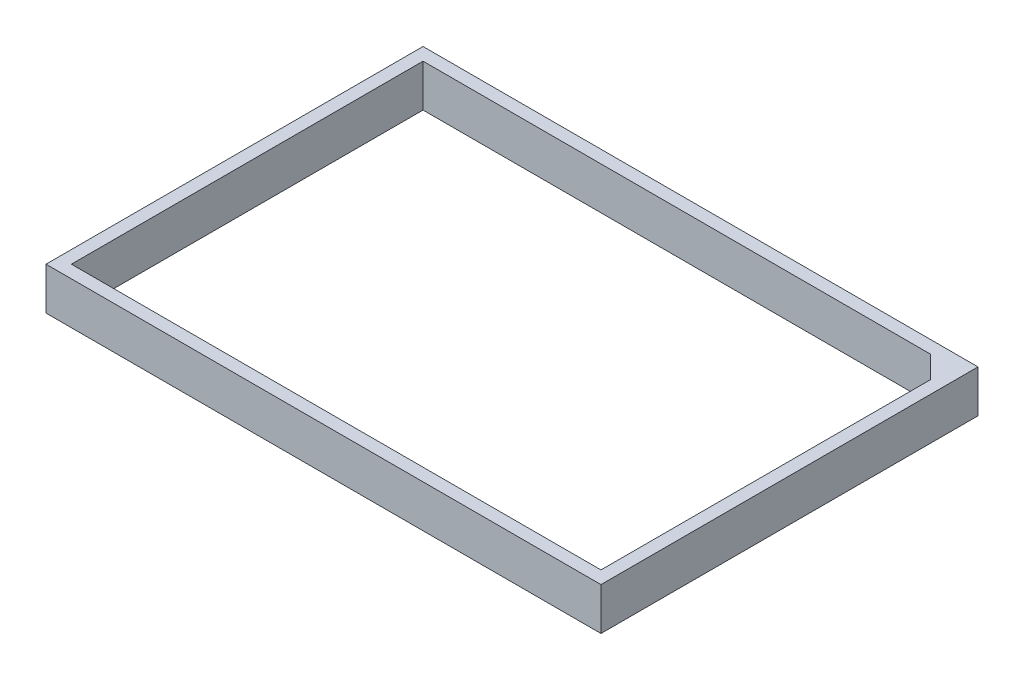
ISO-10303-21;
HEADER;
FILE_DESCRIPTION(('STEP AP214'),'2;1');
FILE_NAME('part.step','',(''),(''),'','','');
FILE_SCHEMA(('AUTOMOTIVE_DESIGN { 1 0 10303 214 1 1 1 1 }'));
ENDSEC;
DATA;
#1=APPLICATION_CONTEXT('core data for automotive mechanical design processes');
#2=APPLICATION_PROTOCOL_DEFINITION('international standard','automotive_design',2000,#1);
#3=PRODUCT_CONTEXT('',#1,'mechanical');
#4=PRODUCT('Part','Part','',(#3));
#5=PRODUCT_RELATED_PRODUCT_CATEGORY('part','',(#4));
#6=PRODUCT_DEFINITION_FORMATION('','',#4);
#7=PRODUCT_DEFINITION_CONTEXT('part definition',#1,'design');
#8=PRODUCT_DEFINITION('design','',#6,#7);
#9=PRODUCT_DEFINITION_SHAPE('','',#8);
#10=(LENGTH_UNIT() NAMED_UNIT(*) SI_UNIT(.MILLI.,.METRE.));
#11=(NAMED_UNIT(*) PLANE_ANGLE_UNIT() SI_UNIT($,.RADIAN.));
#12=(NAMED_UNIT(*) SI_UNIT($,.STERADIAN.) SOLID_ANGLE_UNIT());
#13=UNCERTAINTY_MEASURE_WITH_UNIT(LENGTH_MEASURE(1.E-05),#10,'distance_accuracy_value','');
#14=(GEOMETRIC_REPRESENTATION_CONTEXT(3) GLOBAL_UNCERTAINTY_ASSIGNED_CONTEXT((#13)) GLOBAL_UNIT_ASSIGNED_CONTEXT((#10,
#11,#12)) REPRESENTATION_CONTEXT('',''));
#15=CARTESIAN_POINT('',(0.,0.,0.));
#16=DIRECTION('',(0.,0.,1.));
#17=DIRECTION('',(1.,0.,0.));
#18=AXIS2_PLACEMENT_3D('',#15,#16,#17);
#19=CARTESIAN_POINT('',(65.5,10.,-44.5));
#20=DIRECTION('',(-1.,0.,0.));
#21=DIRECTION('',(0.,0.,1.));
#22=AXIS2_PLACEMENT_3D('',#19,#20,#21);
#23=PLANE('',#22);
#24=DIRECTION('',(0.,0.,-1.));
#25=VECTOR('',#24,1.);
#26=CARTESIAN_POINT('',(65.5,0.,-44.5));
#27=LINE('',#26,#25);
#28=CARTESIAN_POINT('',(65.5,0.,44.5));
#29=VERTEX_POINT('',#28);
#30=CARTESIAN_POINT('',(65.5,0.,-44.5));
#31=VERTEX_POINT('',#30);
#32=EDGE_CURVE('E133',#29,#31,#27,.T.);
#33=ORIENTED_EDGE('',*,*,#32,.T.);
#34=DIRECTION('',(0.,-1.,0.));
#35=VECTOR('',#34,1.);
#36=CARTESIAN_POINT('',(65.5,10.,-44.5));
#37=LINE('',#36,#35);
#38=CARTESIAN_POINT('',(65.5,10.,-44.5));
#39=VERTEX_POINT('',#38);
#40=EDGE_CURVE('E164',#39,#31,#37,.T.);
#41=ORIENTED_EDGE('',*,*,#40,.F.);
#42=DIRECTION('',(0.,0.,-1.));
#43=VECTOR('',#42,1.);
#44=CARTESIAN_POINT('',(65.5,10.,-44.5));
#45=LINE('',#44,#43);
#46=CARTESIAN_POINT('',(65.5,10.,44.5));
#47=VERTEX_POINT('',#46);
#48=EDGE_CURVE('E138',#47,#39,#45,.T.);
#49=ORIENTED_EDGE('',*,*,#48,.F.);
#50=DIRECTION('',(0.,-1.,0.));
#51=VECTOR('',#50,1.);
#52=CARTESIAN_POINT('',(65.5,10.,44.5));
#53=LINE('',#52,#51);
#54=EDGE_CURVE('E148',#47,#29,#53,.T.);
#55=ORIENTED_EDGE('',*,*,#54,.T.);
#56=EDGE_LOOP('',(#33,#41,#49,#55));
#57=FACE_BOUND('',#56,.T.);
#58=ADVANCED_FACE('F34',(#57),#23,.F.);
#59=CARTESIAN_POINT('',(-65.5,10.,-44.5));
#60=DIRECTION('',(0.,0.,1.));
#61=DIRECTION('',(1.,0.,0.));
#62=AXIS2_PLACEMENT_3D('',#59,#60,#61);
#63=PLANE('',#62);
#64=DIRECTION('',(-1.,0.,0.));
#65=VECTOR('',#64,1.);
#66=CARTESIAN_POINT('',(-65.5,0.,-44.5));
#67=LINE('',#66,#65);
#68=CARTESIAN_POINT('',(-65.5,0.,-44.5));
#69=VERTEX_POINT('',#68);
#70=EDGE_CURVE('E151',#31,#69,#67,.T.);
#71=ORIENTED_EDGE('',*,*,#70,.T.);
#72=DIRECTION('',(0.,-1.,0.));
#73=VECTOR('',#72,1.);
#74=CARTESIAN_POINT('',(-65.5,10.,-44.5));
#75=LINE('',#74,#73);
#76=CARTESIAN_POINT('',(-65.5,10.,-44.5));
#77=VERTEX_POINT('',#76);
#78=EDGE_CURVE('E161',#77,#69,#75,.T.);
#79=ORIENTED_EDGE('',*,*,#78,.F.);
#80=DIRECTION('',(-1.,0.,0.));
#81=VECTOR('',#80,1.);
#82=CARTESIAN_POINT('',(-65.5,10.,-44.5));
#83=LINE('',#82,#81);
#84=EDGE_CURVE('E141',#39,#77,#83,.T.);
#85=ORIENTED_EDGE('',*,*,#84,.F.);
#86=ORIENTED_EDGE('',*,*,#40,.T.);
#87=EDGE_LOOP('',(#71,#79,#85,#86));
#88=FACE_BOUND('',#87,.T.);
#89=ADVANCED_FACE('F195',(#88),#63,.F.);
#90=CARTESIAN_POINT('',(-65.5,10.,-44.5));
#91=DIRECTION('',(1.,0.,0.));
#92=DIRECTION('',(0.,0.,-1.));
#93=AXIS2_PLACEMENT_3D('',#90,#91,#92);
#94=PLANE('',#93);
#95=DIRECTION('',(0.,0.,1.));
#96=VECTOR('',#95,1.);
#97=CARTESIAN_POINT('',(-65.5,0.,-44.5));
#98=LINE('',#97,#96);
#99=CARTESIAN_POINT('',(-65.5,0.,44.5));
#100=VERTEX_POINT('',#99);
#101=EDGE_CURVE('E153',#69,#100,#98,.T.);
#102=ORIENTED_EDGE('',*,*,#101,.T.);
#103=DIRECTION('',(0.,-1.,0.));
#104=VECTOR('',#103,1.);
#105=CARTESIAN_POINT('',(-65.5,10.,44.5));
#106=LINE('',#105,#104);
#107=CARTESIAN_POINT('',(-65.5,10.,44.5));
#108=VERTEX_POINT('',#107);
#109=EDGE_CURVE('E158',#108,#100,#106,.T.);
#110=ORIENTED_EDGE('',*,*,#109,.F.);
#111=DIRECTION('',(0.,0.,1.));
#112=VECTOR('',#111,1.);
#113=CARTESIAN_POINT('',(-65.5,10.,-44.5));
#114=LINE('',#113,#112);
#115=EDGE_CURVE('E144',#77,#108,#114,.T.);
#116=ORIENTED_EDGE('',*,*,#115,.F.);
#117=ORIENTED_EDGE('',*,*,#78,.T.);
#118=EDGE_LOOP('',(#102,#110,#116,#117));
#119=FACE_BOUND('',#118,.T.);
#120=ADVANCED_FACE('F200',(#119),#94,.F.);
#121=CARTESIAN_POINT('',(-65.5,10.,44.5));
#122=DIRECTION('',(0.,0.,-1.));
#123=DIRECTION('',(-1.,0.,0.));
#124=AXIS2_PLACEMENT_3D('',#121,#122,#123);
#125=PLANE('',#124);
#126=DIRECTION('',(1.,0.,0.));
#127=VECTOR('',#126,1.);
#128=CARTESIAN_POINT('',(-65.5,0.,44.5));
#129=LINE('',#128,#127);
#130=EDGE_CURVE('E142',#100,#29,#129,.T.);
#131=ORIENTED_EDGE('',*,*,#130,.T.);
#132=ORIENTED_EDGE('',*,*,#54,.F.);
#133=DIRECTION('',(1.,0.,0.));
#134=VECTOR('',#133,1.);
#135=CARTESIAN_POINT('',(-65.5,10.,44.5));
#136=LINE('',#135,#134);
#137=EDGE_CURVE('E146',#108,#47,#136,.T.);
#138=ORIENTED_EDGE('',*,*,#137,.F.);
#139=ORIENTED_EDGE('',*,*,#109,.T.);
#140=EDGE_LOOP('',(#131,#132,#138,#139));
#141=FACE_BOUND('',#140,.T.);
#142=ADVANCED_FACE('F213',(#141),#125,.F.);
#143=CARTESIAN_POINT('',(0.,10.,0.));
#144=DIRECTION('',(0.,1.,0.));
#145=DIRECTION('',(0.,0.,1.));
#146=AXIS2_PLACEMENT_3D('',#143,#144,#145);
#147=PLANE('',#146);
#148=DIRECTION('',(0.,0.,1.));
#149=VECTOR('',#148,1.);
#150=CARTESIAN_POINT('',(-62.5,10.,0.));
#151=LINE('',#150,#149);
#152=CARTESIAN_POINT('',(-62.5,10.,-41.5));
#153=VERTEX_POINT('',#152);
#154=CARTESIAN_POINT('',(-62.5,10.,41.5));
#155=VERTEX_POINT('',#154);
#156=EDGE_CURVE('E48',#153,#155,#151,.T.);
#157=ORIENTED_EDGE('',*,*,#156,.F.);
#158=DIRECTION('',(1.,0.,0.));
#159=VECTOR('',#158,1.);
#160=CARTESIAN_POINT('',(0.,10.,-41.5));
#161=LINE('',#160,#159);
#162=CARTESIAN_POINT('',(57.324264068712,10.,-41.5));
#163=VERTEX_POINT('',#162);
#164=EDGE_CURVE('E126',#153,#163,#161,.T.);
#165=ORIENTED_EDGE('',*,*,#164,.T.);
#166=DIRECTION('',(0.707106781186547,0.,0.707106781186548));
#167=VECTOR('',#166,1.);
#168=CARTESIAN_POINT('',(49.412132034356,10.,-49.412132034356));
#169=LINE('',#168,#167);
#170=CARTESIAN_POINT('',(62.5,10.,-36.3242640687119));
#171=VERTEX_POINT('',#170);
#172=EDGE_CURVE('E124',#163,#171,#169,.T.);
#173=ORIENTED_EDGE('',*,*,#172,.T.);
#174=DIRECTION('',(0.,0.,-1.));
#175=VECTOR('',#174,1.);
#176=CARTESIAN_POINT('',(62.5,10.,0.));
#177=LINE('',#176,#175);
#178=CARTESIAN_POINT('',(62.5,10.,41.5));
#179=VERTEX_POINT('',#178);
#180=EDGE_CURVE('E107',#179,#171,#177,.T.);
#181=ORIENTED_EDGE('',*,*,#180,.F.);
#182=DIRECTION('',(1.,0.,0.));
#183=VECTOR('',#182,1.);
#184=CARTESIAN_POINT('',(0.,10.,41.5));
#185=LINE('',#184,#183);
#186=EDGE_CURVE('E116',#155,#179,#185,.T.);
#187=ORIENTED_EDGE('',*,*,#186,.F.);
#188=EDGE_LOOP('',(#157,#165,#173,#181,#187));
#189=FACE_BOUND('',#188,.T.);
#190=ORIENTED_EDGE('',*,*,#48,.T.);
#191=ORIENTED_EDGE('',*,*,#84,.T.);
#192=ORIENTED_EDGE('',*,*,#115,.T.);
#193=ORIENTED_EDGE('',*,*,#137,.T.);
#194=EDGE_LOOP('',(#190,#191,#192,#193));
#195=FACE_BOUND('',#194,.T.);
#196=ADVANCED_FACE('F120',(#189,#195),#147,.T.);
#197=CARTESIAN_POINT('',(0.,0.,0.));
#198=DIRECTION('',(0.,1.,0.));
#199=DIRECTION('',(0.,0.,1.));
#200=AXIS2_PLACEMENT_3D('',#197,#198,#199);
#201=PLANE('',#200);
#202=DIRECTION('',(1.,0.,0.));
#203=VECTOR('',#202,1.);
#204=CARTESIAN_POINT('',(0.,0.,-41.5));
#205=LINE('',#204,#203);
#206=CARTESIAN_POINT('',(-62.5,0.,-41.5));
#207=VERTEX_POINT('',#206);
#208=CARTESIAN_POINT('',(57.324264068712,0.,-41.5));
#209=VERTEX_POINT('',#208);
#210=EDGE_CURVE('E41',#207,#209,#205,.T.);
#211=ORIENTED_EDGE('',*,*,#210,.F.);
#212=DIRECTION('',(0.,0.,1.));
#213=VECTOR('',#212,1.);
#214=CARTESIAN_POINT('',(-62.5,0.,0.));
#215=LINE('',#214,#213);
#216=CARTESIAN_POINT('',(-62.5,0.,41.5));
#217=VERTEX_POINT('',#216);
#218=EDGE_CURVE('E11',#207,#217,#215,.T.);
#219=ORIENTED_EDGE('',*,*,#218,.T.);
#220=DIRECTION('',(1.,0.,0.));
#221=VECTOR('',#220,1.);
#222=CARTESIAN_POINT('',(0.,0.,41.5));
#223=LINE('',#222,#221);
#224=CARTESIAN_POINT('',(62.5,0.,41.5));
#225=VERTEX_POINT('',#224);
#226=EDGE_CURVE('E167',#217,#225,#223,.T.);
#227=ORIENTED_EDGE('',*,*,#226,.T.);
#228=DIRECTION('',(0.,0.,-1.));
#229=VECTOR('',#228,1.);
#230=CARTESIAN_POINT('',(62.5,0.,0.));
#231=LINE('',#230,#229);
#232=CARTESIAN_POINT('',(62.5,0.,-36.3242640687119));
#233=VERTEX_POINT('',#232);
#234=EDGE_CURVE('E110',#225,#233,#231,.T.);
#235=ORIENTED_EDGE('',*,*,#234,.T.);
#236=DIRECTION('',(0.707106781186547,0.,0.707106781186548));
#237=VECTOR('',#236,1.);
#238=CARTESIAN_POINT('',(49.412132034356,0.,-49.412132034356));
#239=LINE('',#238,#237);
#240=EDGE_CURVE('E170',#209,#233,#239,.T.);
#241=ORIENTED_EDGE('',*,*,#240,.F.);
#242=EDGE_LOOP('',(#211,#219,#227,#235,#241));
#243=FACE_BOUND('',#242,.T.);
#244=ORIENTED_EDGE('',*,*,#32,.F.);
#245=ORIENTED_EDGE('',*,*,#130,.F.);
#246=ORIENTED_EDGE('',*,*,#101,.F.);
#247=ORIENTED_EDGE('',*,*,#70,.F.);
#248=EDGE_LOOP('',(#244,#245,#246,#247));
#249=FACE_BOUND('',#248,.T.);
#250=ADVANCED_FACE('F181',(#243,#249),#201,.F.);
#251=CARTESIAN_POINT('',(-62.5,-90.,0.));
#252=DIRECTION('',(-1.,0.,0.));
#253=DIRECTION('',(0.,0.,1.));
#254=AXIS2_PLACEMENT_3D('',#251,#252,#253);
#255=PLANE('',#254);
#256=DIRECTION('',(0.,1.,0.));
#257=VECTOR('',#256,1.);
#258=CARTESIAN_POINT('',(-62.5,-90.,-41.5));
#259=LINE('',#258,#257);
#260=EDGE_CURVE('E131',#207,#153,#259,.T.);
#261=ORIENTED_EDGE('',*,*,#260,.T.);
#262=ORIENTED_EDGE('',*,*,#156,.T.);
#263=DIRECTION('',(0.,1.,0.));
#264=VECTOR('',#263,1.);
#265=CARTESIAN_POINT('',(-62.5,-90.,41.5));
#266=LINE('',#265,#264);
#267=EDGE_CURVE('E113',#217,#155,#266,.T.);
#268=ORIENTED_EDGE('',*,*,#267,.F.);
#269=ORIENTED_EDGE('',*,*,#218,.F.);
#270=EDGE_LOOP('',(#261,#262,#268,#269));
#271=FACE_BOUND('',#270,.T.);
#272=ADVANCED_FACE('F183',(#271),#255,.F.);
#273=CARTESIAN_POINT('',(0.,-90.,-41.5));
#274=DIRECTION('',(0.,0.,1.));
#275=DIRECTION('',(1.,0.,0.));
#276=AXIS2_PLACEMENT_3D('',#273,#274,#275);
#277=PLANE('',#276);
#278=ORIENTED_EDGE('',*,*,#210,.T.);
#279=DIRECTION('',(0.,1.,0.));
#280=VECTOR('',#279,1.);
#281=CARTESIAN_POINT('',(57.324264068712,-90.,-41.5));
#282=LINE('',#281,#280);
#283=EDGE_CURVE('E134',#209,#163,#282,.T.);
#284=ORIENTED_EDGE('',*,*,#283,.T.);
#285=ORIENTED_EDGE('',*,*,#164,.F.);
#286=ORIENTED_EDGE('',*,*,#260,.F.);
#287=EDGE_LOOP('',(#278,#284,#285,#286));
#288=FACE_BOUND('',#287,.T.);
#289=ADVANCED_FACE('F175',(#288),#277,.T.);
#290=CARTESIAN_POINT('',(49.412132034356,-90.,-49.412132034356));
#291=DIRECTION('',(-0.707106781186548,0.,0.707106781186547));
#292=DIRECTION('',(0.707106781186547,0.,0.707106781186548));
#293=AXIS2_PLACEMENT_3D('',#290,#291,#292);
#294=PLANE('',#293);
#295=ORIENTED_EDGE('',*,*,#240,.T.);
#296=DIRECTION('',(0.,1.,0.));
#297=VECTOR('',#296,1.);
#298=CARTESIAN_POINT('',(62.5,-90.,-36.3242640687119));
#299=LINE('',#298,#297);
#300=EDGE_CURVE('E112',#233,#171,#299,.T.);
#301=ORIENTED_EDGE('',*,*,#300,.T.);
#302=ORIENTED_EDGE('',*,*,#172,.F.);
#303=ORIENTED_EDGE('',*,*,#283,.F.);
#304=EDGE_LOOP('',(#295,#301,#302,#303));
#305=FACE_BOUND('',#304,.T.);
#306=ADVANCED_FACE('F180',(#305),#294,.T.);
#307=CARTESIAN_POINT('',(62.5,-90.,0.));
#308=DIRECTION('',(1.,0.,0.));
#309=DIRECTION('',(0.,0.,-1.));
#310=AXIS2_PLACEMENT_3D('',#307,#308,#309);
#311=PLANE('',#310);
#312=DIRECTION('',(0.,1.,0.));
#313=VECTOR('',#312,1.);
#314=CARTESIAN_POINT('',(62.5,-90.,41.5));
#315=LINE('',#314,#313);
#316=EDGE_CURVE('E56',#225,#179,#315,.T.);
#317=ORIENTED_EDGE('',*,*,#316,.T.);
#318=ORIENTED_EDGE('',*,*,#180,.T.);
#319=ORIENTED_EDGE('',*,*,#300,.F.);
#320=ORIENTED_EDGE('',*,*,#234,.F.);
#321=EDGE_LOOP('',(#317,#318,#319,#320));
#322=FACE_BOUND('',#321,.T.);
#323=ADVANCED_FACE('F104',(#322),#311,.F.);
#324=CARTESIAN_POINT('',(0.,-90.,41.5));
#325=DIRECTION('',(0.,0.,1.));
#326=DIRECTION('',(1.,0.,0.));
#327=AXIS2_PLACEMENT_3D('',#324,#325,#326);
#328=PLANE('',#327);
#329=ORIENTED_EDGE('',*,*,#267,.T.);
#330=ORIENTED_EDGE('',*,*,#186,.T.);
#331=ORIENTED_EDGE('',*,*,#316,.F.);
#332=ORIENTED_EDGE('',*,*,#226,.F.);
#333=EDGE_LOOP('',(#329,#330,#331,#332));
#334=FACE_BOUND('',#333,.T.);
#335=ADVANCED_FACE('F117',(#334),#328,.F.);
#336=CLOSED_SHELL('',(#58,#89,#120,#142,#196,#250,#272,#289,#306,#323,#335));
#337=MANIFOLD_SOLID_BREP('B2',#336);
#338=ADVANCED_BREP_SHAPE_REPRESENTATION('',(#18,#337),#14);
#339=SHAPE_DEFINITION_REPRESENTATION(#9,#338);
ENDSEC;
END-ISO-10303-21;
